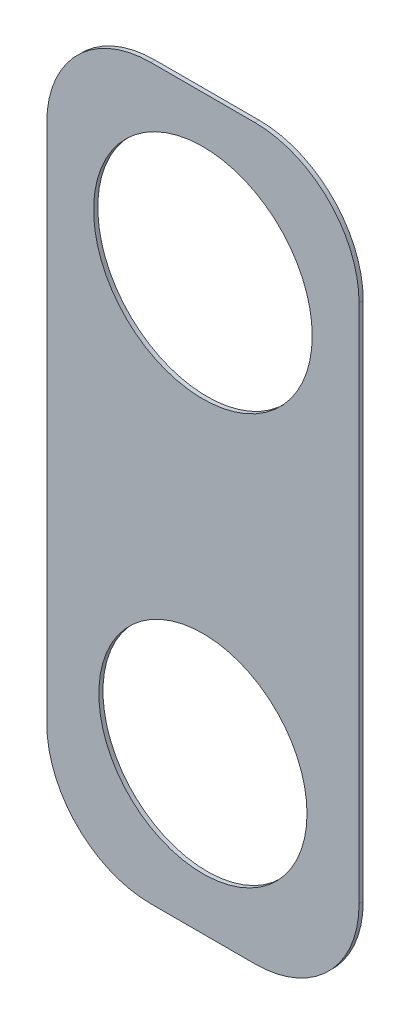
ISO-10303-21;
HEADER;
FILE_DESCRIPTION(('STEP AP214'),'2;1');
FILE_NAME('part.step','',(''),(''),'','','');
FILE_SCHEMA(('AUTOMOTIVE_DESIGN { 1 0 10303 214 1 1 1 1 }'));
ENDSEC;
DATA;
#1=APPLICATION_CONTEXT('core data for automotive mechanical design processes');
#2=APPLICATION_PROTOCOL_DEFINITION('international standard','automotive_design',2000,#1);
#3=PRODUCT_CONTEXT('',#1,'mechanical');
#4=PRODUCT('Part','Part','',(#3));
#5=PRODUCT_RELATED_PRODUCT_CATEGORY('part','',(#4));
#6=PRODUCT_DEFINITION_FORMATION('','',#4);
#7=PRODUCT_DEFINITION_CONTEXT('part definition',#1,'design');
#8=PRODUCT_DEFINITION('design','',#6,#7);
#9=PRODUCT_DEFINITION_SHAPE('','',#8);
#10=(LENGTH_UNIT() NAMED_UNIT(*) SI_UNIT(.MILLI.,.METRE.));
#11=(NAMED_UNIT(*) PLANE_ANGLE_UNIT() SI_UNIT($,.RADIAN.));
#12=(NAMED_UNIT(*) SI_UNIT($,.STERADIAN.) SOLID_ANGLE_UNIT());
#13=UNCERTAINTY_MEASURE_WITH_UNIT(LENGTH_MEASURE(1.E-05),#10,'distance_accuracy_value','');
#14=(GEOMETRIC_REPRESENTATION_CONTEXT(3) GLOBAL_UNCERTAINTY_ASSIGNED_CONTEXT((#13)) GLOBAL_UNIT_ASSIGNED_CONTEXT((#10,
#11,#12)) REPRESENTATION_CONTEXT('',''));
#15=CARTESIAN_POINT('',(0.,0.,0.));
#16=DIRECTION('',(0.,0.,1.));
#17=DIRECTION('',(1.,0.,0.));
#18=AXIS2_PLACEMENT_3D('',#15,#16,#17);
#19=CARTESIAN_POINT('',(12.7,12.7,0.508));
#20=DIRECTION('',(0.,0.,1.));
#21=DIRECTION('',(1.,0.,0.));
#22=AXIS2_PLACEMENT_3D('',#19,#20,#21);
#23=PLANE('',#22);
#24=CARTESIAN_POINT('',(19.05,69.85,0.508));
#25=DIRECTION('',(0.,0.,1.));
#26=DIRECTION('',(1.,0.,0.));
#27=AXIS2_PLACEMENT_3D('',#24,#25,#26);
#28=CIRCLE('',#27,13.335);
#29=CARTESIAN_POINT('',(32.385,69.85,0.508));
#30=VERTEX_POINT('',#29);
#31=EDGE_CURVE('E142',#30,#30,#28,.T.);
#32=ORIENTED_EDGE('',*,*,#31,.F.);
#33=EDGE_LOOP('',(#32));
#34=FACE_BOUND('',#33,.T.);
#35=CARTESIAN_POINT('',(12.7,12.7,0.508));
#36=DIRECTION('',(0.,0.,1.));
#37=DIRECTION('',(1.,0.,0.));
#38=AXIS2_PLACEMENT_3D('',#35,#36,#37);
#39=CIRCLE('',#38,12.7);
#40=CARTESIAN_POINT('',(0.,12.7000000000001,0.508));
#41=VERTEX_POINT('',#40);
#42=CARTESIAN_POINT('',(12.7000000000001,0.,0.508));
#43=VERTEX_POINT('',#42);
#44=EDGE_CURVE('E154',#41,#43,#39,.T.);
#45=ORIENTED_EDGE('',*,*,#44,.T.);
#46=DIRECTION('',(1.,0.,0.));
#47=VECTOR('',#46,1.);
#48=CARTESIAN_POINT('',(12.7000000000001,0.,0.508));
#49=LINE('',#48,#47);
#50=CARTESIAN_POINT('',(25.3999999999999,0.,0.508));
#51=VERTEX_POINT('',#50);
#52=EDGE_CURVE('E105',#43,#51,#49,.T.);
#53=ORIENTED_EDGE('',*,*,#52,.T.);
#54=CARTESIAN_POINT('',(25.4,12.7,0.508));
#55=DIRECTION('',(0.,0.,1.));
#56=DIRECTION('',(1.,0.,0.));
#57=AXIS2_PLACEMENT_3D('',#54,#55,#56);
#58=CIRCLE('',#57,12.7);
#59=CARTESIAN_POINT('',(38.1,12.7000000000001,0.508));
#60=VERTEX_POINT('',#59);
#61=EDGE_CURVE('E170',#51,#60,#58,.T.);
#62=ORIENTED_EDGE('',*,*,#61,.T.);
#63=DIRECTION('',(0.,1.,0.));
#64=VECTOR('',#63,1.);
#65=CARTESIAN_POINT('',(38.1,12.7000000000001,0.508));
#66=LINE('',#65,#64);
#67=CARTESIAN_POINT('',(38.1,76.1999999999999,0.508));
#68=VERTEX_POINT('',#67);
#69=EDGE_CURVE('E185',#60,#68,#66,.T.);
#70=ORIENTED_EDGE('',*,*,#69,.T.);
#71=CARTESIAN_POINT('',(25.4,76.2,0.508));
#72=DIRECTION('',(0.,0.,1.));
#73=DIRECTION('',(1.,0.,0.));
#74=AXIS2_PLACEMENT_3D('',#71,#72,#73);
#75=CIRCLE('',#74,12.7);
#76=CARTESIAN_POINT('',(25.3999999999999,88.9,0.508));
#77=VERTEX_POINT('',#76);
#78=EDGE_CURVE('E123',#68,#77,#75,.T.);
#79=ORIENTED_EDGE('',*,*,#78,.T.);
#80=DIRECTION('',(-1.,0.,0.));
#81=VECTOR('',#80,1.);
#82=CARTESIAN_POINT('',(12.7000000000001,88.9,0.508));
#83=LINE('',#82,#81);
#84=CARTESIAN_POINT('',(12.7000000000001,88.9,0.508));
#85=VERTEX_POINT('',#84);
#86=EDGE_CURVE('E113',#77,#85,#83,.T.);
#87=ORIENTED_EDGE('',*,*,#86,.T.);
#88=CARTESIAN_POINT('',(12.7,76.2,0.508));
#89=DIRECTION('',(0.,0.,1.));
#90=DIRECTION('',(1.,0.,0.));
#91=AXIS2_PLACEMENT_3D('',#88,#89,#90);
#92=CIRCLE('',#91,12.7);
#93=CARTESIAN_POINT('',(0.,76.1999999999999,0.508));
#94=VERTEX_POINT('',#93);
#95=EDGE_CURVE('E118',#85,#94,#92,.T.);
#96=ORIENTED_EDGE('',*,*,#95,.T.);
#97=DIRECTION('',(0.,-1.,0.));
#98=VECTOR('',#97,1.);
#99=CARTESIAN_POINT('',(0.,12.7000000000001,0.508));
#100=LINE('',#99,#98);
#101=EDGE_CURVE('E56',#94,#41,#100,.T.);
#102=ORIENTED_EDGE('',*,*,#101,.T.);
#103=EDGE_LOOP('',(#45,#53,#62,#70,#79,#87,#96,#102));
#104=FACE_BOUND('',#103,.T.);
#105=CARTESIAN_POINT('',(19.05,19.05,0.508));
#106=DIRECTION('',(0.,0.,1.));
#107=DIRECTION('',(1.,0.,0.));
#108=AXIS2_PLACEMENT_3D('',#105,#106,#107);
#109=CIRCLE('',#108,12.7);
#110=CARTESIAN_POINT('',(31.75,19.05,0.508));
#111=VERTEX_POINT('',#110);
#112=EDGE_CURVE('E192',#111,#111,#109,.T.);
#113=ORIENTED_EDGE('',*,*,#112,.F.);
#114=EDGE_LOOP('',(#113));
#115=FACE_BOUND('',#114,.T.);
#116=ADVANCED_FACE('F45',(#34,#104,#115),#23,.T.);
#117=CARTESIAN_POINT('',(12.7,12.7,0.));
#118=DIRECTION('',(0.,0.,1.));
#119=DIRECTION('',(1.,0.,0.));
#120=AXIS2_PLACEMENT_3D('',#117,#118,#119);
#121=PLANE('',#120);
#122=CARTESIAN_POINT('',(12.7,12.7,0.));
#123=DIRECTION('',(0.,0.,1.));
#124=DIRECTION('',(1.,0.,0.));
#125=AXIS2_PLACEMENT_3D('',#122,#123,#124);
#126=CIRCLE('',#125,12.7);
#127=CARTESIAN_POINT('',(0.,12.7000000000001,0.));
#128=VERTEX_POINT('',#127);
#129=CARTESIAN_POINT('',(12.7000000000001,0.,0.));
#130=VERTEX_POINT('',#129);
#131=EDGE_CURVE('E137',#128,#130,#126,.T.);
#132=ORIENTED_EDGE('',*,*,#131,.F.);
#133=DIRECTION('',(0.,-1.,0.));
#134=VECTOR('',#133,1.);
#135=CARTESIAN_POINT('',(0.,12.7000000000001,0.));
#136=LINE('',#135,#134);
#137=CARTESIAN_POINT('',(0.,76.1999999999999,0.));
#138=VERTEX_POINT('',#137);
#139=EDGE_CURVE('E92',#138,#128,#136,.T.);
#140=ORIENTED_EDGE('',*,*,#139,.F.);
#141=CARTESIAN_POINT('',(12.7,76.2,0.));
#142=DIRECTION('',(0.,0.,1.));
#143=DIRECTION('',(1.,0.,0.));
#144=AXIS2_PLACEMENT_3D('',#141,#142,#143);
#145=CIRCLE('',#144,12.7);
#146=CARTESIAN_POINT('',(12.7000000000001,88.9,0.));
#147=VERTEX_POINT('',#146);
#148=EDGE_CURVE('E88',#147,#138,#145,.T.);
#149=ORIENTED_EDGE('',*,*,#148,.F.);
#150=DIRECTION('',(-1.,0.,0.));
#151=VECTOR('',#150,1.);
#152=CARTESIAN_POINT('',(12.7000000000001,88.9,0.));
#153=LINE('',#152,#151);
#154=CARTESIAN_POINT('',(25.3999999999999,88.9,0.));
#155=VERTEX_POINT('',#154);
#156=EDGE_CURVE('E129',#155,#147,#153,.T.);
#157=ORIENTED_EDGE('',*,*,#156,.F.);
#158=CARTESIAN_POINT('',(25.4,76.2,0.));
#159=DIRECTION('',(0.,0.,1.));
#160=DIRECTION('',(1.,0.,0.));
#161=AXIS2_PLACEMENT_3D('',#158,#159,#160);
#162=CIRCLE('',#161,12.7);
#163=CARTESIAN_POINT('',(38.1,76.1999999999999,0.));
#164=VERTEX_POINT('',#163);
#165=EDGE_CURVE('E146',#164,#155,#162,.T.);
#166=ORIENTED_EDGE('',*,*,#165,.F.);
#167=DIRECTION('',(0.,1.,0.));
#168=VECTOR('',#167,1.);
#169=CARTESIAN_POINT('',(38.1,12.7000000000001,0.));
#170=LINE('',#169,#168);
#171=CARTESIAN_POINT('',(38.1,12.7000000000001,0.));
#172=VERTEX_POINT('',#171);
#173=EDGE_CURVE('E150',#172,#164,#170,.T.);
#174=ORIENTED_EDGE('',*,*,#173,.F.);
#175=CARTESIAN_POINT('',(25.4,12.7,0.));
#176=DIRECTION('',(0.,0.,1.));
#177=DIRECTION('',(1.,0.,0.));
#178=AXIS2_PLACEMENT_3D('',#175,#176,#177);
#179=CIRCLE('',#178,12.7);
#180=CARTESIAN_POINT('',(25.3999999999999,0.,0.));
#181=VERTEX_POINT('',#180);
#182=EDGE_CURVE('E144',#181,#172,#179,.T.);
#183=ORIENTED_EDGE('',*,*,#182,.F.);
#184=DIRECTION('',(1.,0.,0.));
#185=VECTOR('',#184,1.);
#186=CARTESIAN_POINT('',(12.7000000000001,0.,0.));
#187=LINE('',#186,#185);
#188=EDGE_CURVE('E145',#130,#181,#187,.T.);
#189=ORIENTED_EDGE('',*,*,#188,.F.);
#190=EDGE_LOOP('',(#132,#140,#149,#157,#166,#174,#183,#189));
#191=FACE_BOUND('',#190,.T.);
#192=CARTESIAN_POINT('',(19.05,69.85,0.));
#193=DIRECTION('',(0.,0.,1.));
#194=DIRECTION('',(1.,0.,0.));
#195=AXIS2_PLACEMENT_3D('',#192,#193,#194);
#196=CIRCLE('',#195,13.335);
#197=CARTESIAN_POINT('',(32.385,69.85,0.));
#198=VERTEX_POINT('',#197);
#199=EDGE_CURVE('E187',#198,#198,#196,.T.);
#200=ORIENTED_EDGE('',*,*,#199,.T.);
#201=EDGE_LOOP('',(#200));
#202=FACE_BOUND('',#201,.T.);
#203=CARTESIAN_POINT('',(19.05,19.05,0.));
#204=DIRECTION('',(0.,0.,1.));
#205=DIRECTION('',(1.,0.,0.));
#206=AXIS2_PLACEMENT_3D('',#203,#204,#205);
#207=CIRCLE('',#206,12.7);
#208=CARTESIAN_POINT('',(31.75,19.05,0.));
#209=VERTEX_POINT('',#208);
#210=EDGE_CURVE('E191',#209,#209,#207,.T.);
#211=ORIENTED_EDGE('',*,*,#210,.T.);
#212=EDGE_LOOP('',(#211));
#213=FACE_BOUND('',#212,.T.);
#214=ADVANCED_FACE('F171',(#191,#202,#213),#121,.F.);
#215=CARTESIAN_POINT('',(12.7,12.7,0.508));
#216=DIRECTION('',(0.,0.,-1.));
#217=DIRECTION('',(-1.,0.,0.));
#218=AXIS2_PLACEMENT_3D('',#215,#216,#217);
#219=CYLINDRICAL_SURFACE('',#218,12.7);
#220=ORIENTED_EDGE('',*,*,#131,.T.);
#221=DIRECTION('',(0.,0.,-1.));
#222=VECTOR('',#221,1.);
#223=CARTESIAN_POINT('',(12.7000000000001,0.,0.508));
#224=LINE('',#223,#222);
#225=EDGE_CURVE('E11',#43,#130,#224,.T.);
#226=ORIENTED_EDGE('',*,*,#225,.F.);
#227=ORIENTED_EDGE('',*,*,#44,.F.);
#228=DIRECTION('',(0.,0.,-1.));
#229=VECTOR('',#228,1.);
#230=CARTESIAN_POINT('',(0.,12.7000000000001,0.508));
#231=LINE('',#230,#229);
#232=EDGE_CURVE('E134',#41,#128,#231,.T.);
#233=ORIENTED_EDGE('',*,*,#232,.T.);
#234=EDGE_LOOP('',(#220,#226,#227,#233));
#235=FACE_BOUND('',#234,.T.);
#236=ADVANCED_FACE('F42',(#235),#219,.T.);
#237=CARTESIAN_POINT('',(12.7000000000001,0.,0.508));
#238=DIRECTION('',(0.,1.,0.));
#239=DIRECTION('',(0.,0.,1.));
#240=AXIS2_PLACEMENT_3D('',#237,#238,#239);
#241=PLANE('',#240);
#242=ORIENTED_EDGE('',*,*,#188,.T.);
#243=DIRECTION('',(0.,0.,-1.));
#244=VECTOR('',#243,1.);
#245=CARTESIAN_POINT('',(25.3999999999999,0.,0.508));
#246=LINE('',#245,#244);
#247=EDGE_CURVE('E51',#51,#181,#246,.T.);
#248=ORIENTED_EDGE('',*,*,#247,.F.);
#249=ORIENTED_EDGE('',*,*,#52,.F.);
#250=ORIENTED_EDGE('',*,*,#225,.T.);
#251=EDGE_LOOP('',(#242,#248,#249,#250));
#252=FACE_BOUND('',#251,.T.);
#253=ADVANCED_FACE('F226',(#252),#241,.F.);
#254=CARTESIAN_POINT('',(25.4,12.7,0.508));
#255=DIRECTION('',(0.,0.,-1.));
#256=DIRECTION('',(-1.,0.,0.));
#257=AXIS2_PLACEMENT_3D('',#254,#255,#256);
#258=CYLINDRICAL_SURFACE('',#257,12.7);
#259=ORIENTED_EDGE('',*,*,#182,.T.);
#260=DIRECTION('',(0.,0.,-1.));
#261=VECTOR('',#260,1.);
#262=CARTESIAN_POINT('',(38.1,12.7000000000001,0.508));
#263=LINE('',#262,#261);
#264=EDGE_CURVE('E161',#60,#172,#263,.T.);
#265=ORIENTED_EDGE('',*,*,#264,.F.);
#266=ORIENTED_EDGE('',*,*,#61,.F.);
#267=ORIENTED_EDGE('',*,*,#247,.T.);
#268=EDGE_LOOP('',(#259,#265,#266,#267));
#269=FACE_BOUND('',#268,.T.);
#270=ADVANCED_FACE('F167',(#269),#258,.T.);
#271=CARTESIAN_POINT('',(38.1,12.7000000000001,0.508));
#272=DIRECTION('',(-1.,0.,0.));
#273=DIRECTION('',(0.,0.,1.));
#274=AXIS2_PLACEMENT_3D('',#271,#272,#273);
#275=PLANE('',#274);
#276=ORIENTED_EDGE('',*,*,#173,.T.);
#277=DIRECTION('',(0.,0.,-1.));
#278=VECTOR('',#277,1.);
#279=CARTESIAN_POINT('',(38.1,76.1999999999999,0.508));
#280=LINE('',#279,#278);
#281=EDGE_CURVE('E156',#68,#164,#280,.T.);
#282=ORIENTED_EDGE('',*,*,#281,.F.);
#283=ORIENTED_EDGE('',*,*,#69,.F.);
#284=ORIENTED_EDGE('',*,*,#264,.T.);
#285=EDGE_LOOP('',(#276,#282,#283,#284));
#286=FACE_BOUND('',#285,.T.);
#287=ADVANCED_FACE('F178',(#286),#275,.F.);
#288=CARTESIAN_POINT('',(25.4,76.2,0.508));
#289=DIRECTION('',(0.,0.,-1.));
#290=DIRECTION('',(-1.,0.,0.));
#291=AXIS2_PLACEMENT_3D('',#288,#289,#290);
#292=CYLINDRICAL_SURFACE('',#291,12.7);
#293=ORIENTED_EDGE('',*,*,#165,.T.);
#294=DIRECTION('',(0.,0.,-1.));
#295=VECTOR('',#294,1.);
#296=CARTESIAN_POINT('',(25.3999999999999,88.9,0.508));
#297=LINE('',#296,#295);
#298=EDGE_CURVE('E127',#77,#155,#297,.T.);
#299=ORIENTED_EDGE('',*,*,#298,.F.);
#300=ORIENTED_EDGE('',*,*,#78,.F.);
#301=ORIENTED_EDGE('',*,*,#281,.T.);
#302=EDGE_LOOP('',(#293,#299,#300,#301));
#303=FACE_BOUND('',#302,.T.);
#304=ADVANCED_FACE('F181',(#303),#292,.T.);
#305=CARTESIAN_POINT('',(12.7000000000001,88.9,0.508));
#306=DIRECTION('',(0.,-1.,0.));
#307=DIRECTION('',(0.,0.,-1.));
#308=AXIS2_PLACEMENT_3D('',#305,#306,#307);
#309=PLANE('',#308);
#310=ORIENTED_EDGE('',*,*,#156,.T.);
#311=DIRECTION('',(0.,0.,-1.));
#312=VECTOR('',#311,1.);
#313=CARTESIAN_POINT('',(12.7000000000001,88.9,0.508));
#314=LINE('',#313,#312);
#315=EDGE_CURVE('E128',#85,#147,#314,.T.);
#316=ORIENTED_EDGE('',*,*,#315,.F.);
#317=ORIENTED_EDGE('',*,*,#86,.F.);
#318=ORIENTED_EDGE('',*,*,#298,.T.);
#319=EDGE_LOOP('',(#310,#316,#317,#318));
#320=FACE_BOUND('',#319,.T.);
#321=ADVANCED_FACE('F130',(#320),#309,.F.);
#322=CARTESIAN_POINT('',(12.7,76.2,0.508));
#323=DIRECTION('',(0.,0.,-1.));
#324=DIRECTION('',(-1.,0.,0.));
#325=AXIS2_PLACEMENT_3D('',#322,#323,#324);
#326=CYLINDRICAL_SURFACE('',#325,12.7);
#327=ORIENTED_EDGE('',*,*,#148,.T.);
#328=DIRECTION('',(0.,0.,-1.));
#329=VECTOR('',#328,1.);
#330=CARTESIAN_POINT('',(0.,76.1999999999999,0.508));
#331=LINE('',#330,#329);
#332=EDGE_CURVE('E131',#94,#138,#331,.T.);
#333=ORIENTED_EDGE('',*,*,#332,.F.);
#334=ORIENTED_EDGE('',*,*,#95,.F.);
#335=ORIENTED_EDGE('',*,*,#315,.T.);
#336=EDGE_LOOP('',(#327,#333,#334,#335));
#337=FACE_BOUND('',#336,.T.);
#338=ADVANCED_FACE('F133',(#337),#326,.T.);
#339=CARTESIAN_POINT('',(0.,12.7000000000001,0.508));
#340=DIRECTION('',(1.,0.,0.));
#341=DIRECTION('',(0.,0.,-1.));
#342=AXIS2_PLACEMENT_3D('',#339,#340,#341);
#343=PLANE('',#342);
#344=ORIENTED_EDGE('',*,*,#139,.T.);
#345=ORIENTED_EDGE('',*,*,#232,.F.);
#346=ORIENTED_EDGE('',*,*,#101,.F.);
#347=ORIENTED_EDGE('',*,*,#332,.T.);
#348=EDGE_LOOP('',(#344,#345,#346,#347));
#349=FACE_BOUND('',#348,.T.);
#350=ADVANCED_FACE('F215',(#349),#343,.F.);
#351=CARTESIAN_POINT('',(19.05,69.85,0.508));
#352=DIRECTION('',(0.,0.,-1.));
#353=DIRECTION('',(-1.,0.,0.));
#354=AXIS2_PLACEMENT_3D('',#351,#352,#353);
#355=CYLINDRICAL_SURFACE('',#354,13.335);
#356=ORIENTED_EDGE('',*,*,#31,.T.);
#357=EDGE_LOOP('',(#356));
#358=FACE_BOUND('',#357,.T.);
#359=ORIENTED_EDGE('',*,*,#199,.F.);
#360=EDGE_LOOP('',(#359));
#361=FACE_BOUND('',#360,.T.);
#362=ADVANCED_FACE('F213',(#358,#361),#355,.F.);
#363=CARTESIAN_POINT('',(19.05,19.05,0.508));
#364=DIRECTION('',(0.,0.,-1.));
#365=DIRECTION('',(-1.,0.,0.));
#366=AXIS2_PLACEMENT_3D('',#363,#364,#365);
#367=CYLINDRICAL_SURFACE('',#366,12.7);
#368=ORIENTED_EDGE('',*,*,#112,.T.);
#369=EDGE_LOOP('',(#368));
#370=FACE_BOUND('',#369,.T.);
#371=ORIENTED_EDGE('',*,*,#210,.F.);
#372=EDGE_LOOP('',(#371));
#373=FACE_BOUND('',#372,.T.);
#374=ADVANCED_FACE('F197',(#370,#373),#367,.F.);
#375=CLOSED_SHELL('',(#116,#214,#236,#253,#270,#287,#304,#321,#338,#350,#362,#374));
#376=MANIFOLD_SOLID_BREP('B2',#375);
#377=ADVANCED_BREP_SHAPE_REPRESENTATION('',(#18,#376),#14);
#378=SHAPE_DEFINITION_REPRESENTATION(#9,#377);
ENDSEC;
END-ISO-10303-21;
